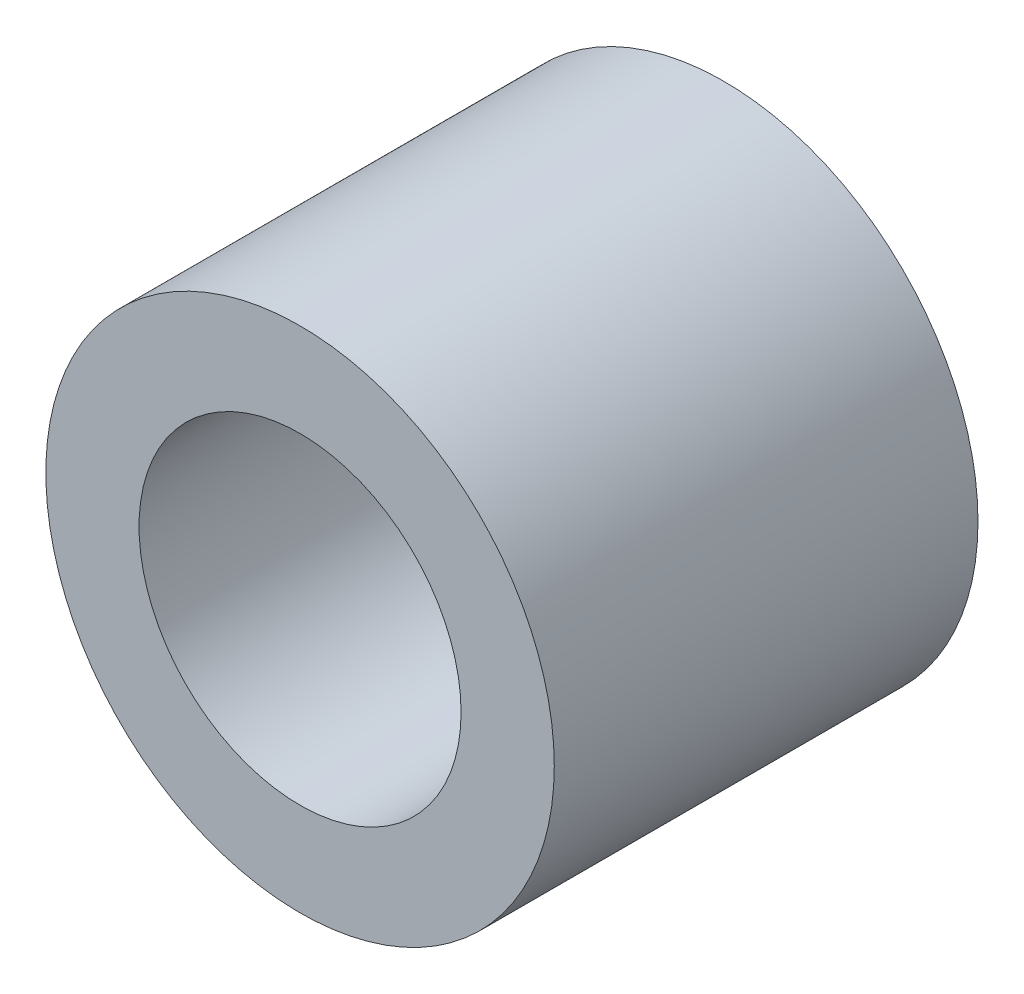
ISO-10303-21;
HEADER;
FILE_DESCRIPTION(('STEP AP214'),'2;1');
FILE_NAME('part.step','',(''),(''),'','','');
FILE_SCHEMA(('AUTOMOTIVE_DESIGN { 1 0 10303 214 1 1 1 1 }'));
ENDSEC;
DATA;
#1=APPLICATION_CONTEXT('core data for automotive mechanical design processes');
#2=APPLICATION_PROTOCOL_DEFINITION('international standard','automotive_design',2000,#1);
#3=PRODUCT_CONTEXT('',#1,'mechanical');
#4=PRODUCT('Part','Part','',(#3));
#5=PRODUCT_RELATED_PRODUCT_CATEGORY('part','',(#4));
#6=PRODUCT_DEFINITION_FORMATION('','',#4);
#7=PRODUCT_DEFINITION_CONTEXT('part definition',#1,'design');
#8=PRODUCT_DEFINITION('design','',#6,#7);
#9=PRODUCT_DEFINITION_SHAPE('','',#8);
#10=(LENGTH_UNIT() NAMED_UNIT(*) SI_UNIT(.MILLI.,.METRE.));
#11=(NAMED_UNIT(*) PLANE_ANGLE_UNIT() SI_UNIT($,.RADIAN.));
#12=(NAMED_UNIT(*) SI_UNIT($,.STERADIAN.) SOLID_ANGLE_UNIT());
#13=UNCERTAINTY_MEASURE_WITH_UNIT(LENGTH_MEASURE(1.E-05),#10,'distance_accuracy_value','');
#14=(GEOMETRIC_REPRESENTATION_CONTEXT(3) GLOBAL_UNCERTAINTY_ASSIGNED_CONTEXT((#13)) GLOBAL_UNIT_ASSIGNED_CONTEXT((#10,
#11,#12)) REPRESENTATION_CONTEXT('',''));
#15=CARTESIAN_POINT('',(0.,0.,0.));
#16=DIRECTION('',(0.,0.,1.));
#17=DIRECTION('',(1.,0.,0.));
#18=AXIS2_PLACEMENT_3D('',#15,#16,#17);
#19=CARTESIAN_POINT('',(0.,0.,5.));
#20=DIRECTION('',(0.,0.,1.));
#21=DIRECTION('',(1.,0.,0.));
#22=AXIS2_PLACEMENT_3D('',#19,#20,#21);
#23=PLANE('',#22);
#24=CARTESIAN_POINT('',(0.,0.,5.));
#25=DIRECTION('',(0.,0.,1.));
#26=DIRECTION('',(1.,0.,0.));
#27=AXIS2_PLACEMENT_3D('',#24,#25,#26);
#28=CIRCLE('',#27,3.);
#29=CARTESIAN_POINT('',(3.,0.,5.));
#30=VERTEX_POINT('',#29);
#31=EDGE_CURVE('E10',#30,#30,#28,.T.);
#32=ORIENTED_EDGE('',*,*,#31,.T.);
#33=EDGE_LOOP('',(#32));
#34=FACE_BOUND('',#33,.T.);
#35=CARTESIAN_POINT('',(0.,0.,5.));
#36=DIRECTION('',(0.,0.,1.));
#37=DIRECTION('',(1.,0.,0.));
#38=AXIS2_PLACEMENT_3D('',#35,#36,#37);
#39=CIRCLE('',#38,1.9);
#40=CARTESIAN_POINT('',(1.9,0.,5.));
#41=VERTEX_POINT('',#40);
#42=EDGE_CURVE('E48',#41,#41,#39,.T.);
#43=ORIENTED_EDGE('',*,*,#42,.F.);
#44=EDGE_LOOP('',(#43));
#45=FACE_BOUND('',#44,.T.);
#46=ADVANCED_FACE('F37',(#34,#45),#23,.T.);
#47=CARTESIAN_POINT('',(0.,0.,0.));
#48=DIRECTION('',(0.,0.,1.));
#49=DIRECTION('',(1.,0.,0.));
#50=AXIS2_PLACEMENT_3D('',#47,#48,#49);
#51=PLANE('',#50);
#52=CARTESIAN_POINT('',(0.,0.,0.));
#53=DIRECTION('',(0.,0.,1.));
#54=DIRECTION('',(1.,0.,0.));
#55=AXIS2_PLACEMENT_3D('',#52,#53,#54);
#56=CIRCLE('',#55,3.);
#57=CARTESIAN_POINT('',(3.,0.,0.));
#58=VERTEX_POINT('',#57);
#59=EDGE_CURVE('E41',#58,#58,#56,.T.);
#60=ORIENTED_EDGE('',*,*,#59,.F.);
#61=EDGE_LOOP('',(#60));
#62=FACE_BOUND('',#61,.T.);
#63=CARTESIAN_POINT('',(0.,0.,0.));
#64=DIRECTION('',(0.,0.,1.));
#65=DIRECTION('',(1.,0.,0.));
#66=AXIS2_PLACEMENT_3D('',#63,#64,#65);
#67=CIRCLE('',#66,1.9);
#68=CARTESIAN_POINT('',(1.9,0.,0.));
#69=VERTEX_POINT('',#68);
#70=EDGE_CURVE('E50',#69,#69,#67,.T.);
#71=ORIENTED_EDGE('',*,*,#70,.T.);
#72=EDGE_LOOP('',(#71));
#73=FACE_BOUND('',#72,.T.);
#74=ADVANCED_FACE('F60',(#62,#73),#51,.F.);
#75=CARTESIAN_POINT('',(0.,0.,5.));
#76=DIRECTION('',(0.,0.,-1.));
#77=DIRECTION('',(-1.,0.,0.));
#78=AXIS2_PLACEMENT_3D('',#75,#76,#77);
#79=CYLINDRICAL_SURFACE('',#78,3.);
#80=ORIENTED_EDGE('',*,*,#31,.F.);
#81=EDGE_LOOP('',(#80));
#82=FACE_BOUND('',#81,.T.);
#83=ORIENTED_EDGE('',*,*,#59,.T.);
#84=EDGE_LOOP('',(#83));
#85=FACE_BOUND('',#84,.T.);
#86=ADVANCED_FACE('F39',(#82,#85),#79,.T.);
#87=CARTESIAN_POINT('',(0.,0.,5.));
#88=DIRECTION('',(0.,0.,-1.));
#89=DIRECTION('',(-1.,0.,0.));
#90=AXIS2_PLACEMENT_3D('',#87,#88,#89);
#91=CYLINDRICAL_SURFACE('',#90,1.9);
#92=ORIENTED_EDGE('',*,*,#42,.T.);
#93=EDGE_LOOP('',(#92));
#94=FACE_BOUND('',#93,.T.);
#95=ORIENTED_EDGE('',*,*,#70,.F.);
#96=EDGE_LOOP('',(#95));
#97=FACE_BOUND('',#96,.T.);
#98=ADVANCED_FACE('F56',(#94,#97),#91,.F.);
#99=CLOSED_SHELL('',(#46,#74,#86,#98));
#100=MANIFOLD_SOLID_BREP('B2',#99);
#101=ADVANCED_BREP_SHAPE_REPRESENTATION('',(#18,#100),#14);
#102=SHAPE_DEFINITION_REPRESENTATION(#9,#101);
ENDSEC;
END-ISO-10303-21;
